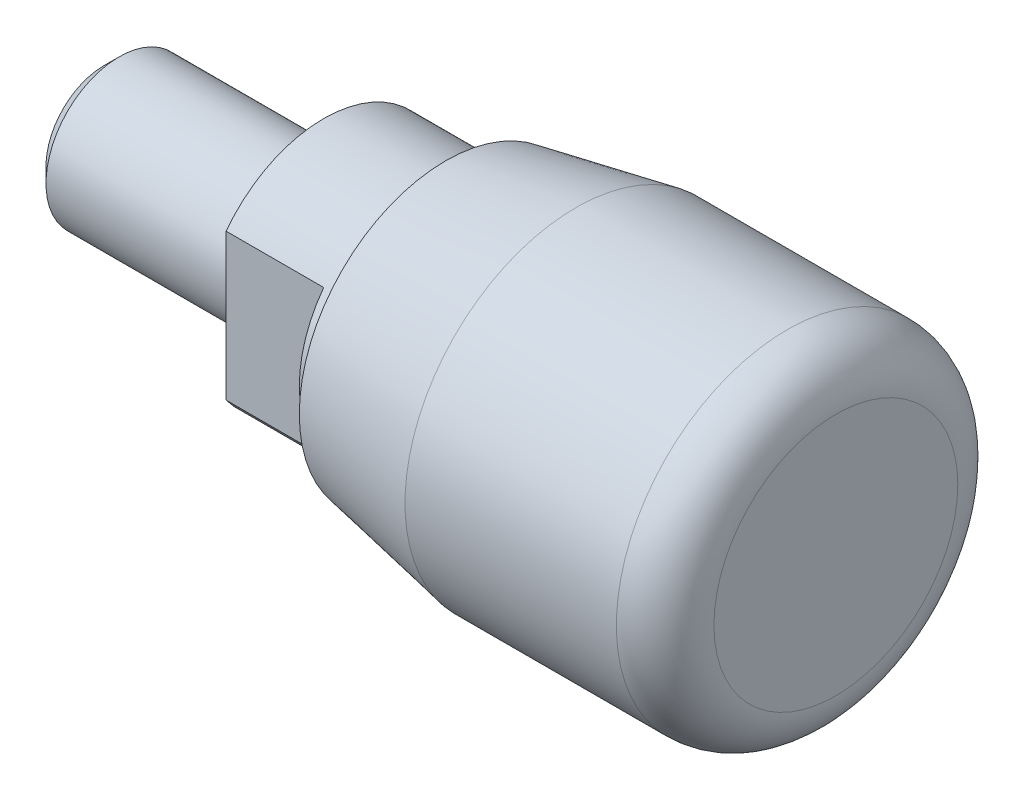
ISO-10303-21;
HEADER;
FILE_DESCRIPTION(('STEP AP214'),'2;1');
FILE_NAME('part.step','',(''),(''),'','','');
FILE_SCHEMA(('AUTOMOTIVE_DESIGN { 1 0 10303 214 1 1 1 1 }'));
ENDSEC;
DATA;
#1=APPLICATION_CONTEXT('core data for automotive mechanical design processes');
#2=APPLICATION_PROTOCOL_DEFINITION('international standard','automotive_design',2000,#1);
#3=PRODUCT_CONTEXT('',#1,'mechanical');
#4=PRODUCT('Part','Part','',(#3));
#5=PRODUCT_RELATED_PRODUCT_CATEGORY('part','',(#4));
#6=PRODUCT_DEFINITION_FORMATION('','',#4);
#7=PRODUCT_DEFINITION_CONTEXT('part definition',#1,'design');
#8=PRODUCT_DEFINITION('design','',#6,#7);
#9=PRODUCT_DEFINITION_SHAPE('','',#8);
#10=(LENGTH_UNIT() NAMED_UNIT(*) SI_UNIT(.MILLI.,.METRE.));
#11=(NAMED_UNIT(*) PLANE_ANGLE_UNIT() SI_UNIT($,.RADIAN.));
#12=(NAMED_UNIT(*) SI_UNIT($,.STERADIAN.) SOLID_ANGLE_UNIT());
#13=UNCERTAINTY_MEASURE_WITH_UNIT(LENGTH_MEASURE(1.E-05),#10,'distance_accuracy_value','');
#14=(GEOMETRIC_REPRESENTATION_CONTEXT(3) GLOBAL_UNCERTAINTY_ASSIGNED_CONTEXT((#13)) GLOBAL_UNIT_ASSIGNED_CONTEXT((#10,
#11,#12)) REPRESENTATION_CONTEXT('',''));
#15=CARTESIAN_POINT('',(0.,0.,0.));
#16=DIRECTION('',(0.,0.,1.));
#17=DIRECTION('',(1.,0.,0.));
#18=AXIS2_PLACEMENT_3D('',#15,#16,#17);
#19=CARTESIAN_POINT('',(4.,3.,4.));
#20=DIRECTION('',(0.,0.,-1.));
#21=DIRECTION('',(0.,-1.,0.));
#22=AXIS2_PLACEMENT_3D('',#19,#20,#21);
#23=PLANE('',#22);
#24=DIRECTION('',(0.,-1.,0.));
#25=VECTOR('',#24,1.);
#26=CARTESIAN_POINT('',(0.,3.,4.));
#27=LINE('',#26,#25);
#28=CARTESIAN_POINT('',(0.,3.,4.));
#29=VERTEX_POINT('',#28);
#30=CARTESIAN_POINT('',(0.,-3.,4.));
#31=VERTEX_POINT('',#30);
#32=EDGE_CURVE('E131',#29,#31,#27,.T.);
#33=ORIENTED_EDGE('',*,*,#32,.T.);
#34=DIRECTION('',(-1.,0.,0.));
#35=VECTOR('',#34,1.);
#36=CARTESIAN_POINT('',(4.,-3.,4.));
#37=LINE('',#36,#35);
#38=CARTESIAN_POINT('',(4.,-3.,4.));
#39=VERTEX_POINT('',#38);
#40=EDGE_CURVE('E119',#39,#31,#37,.T.);
#41=ORIENTED_EDGE('',*,*,#40,.F.);
#42=DIRECTION('',(0.,-1.,0.));
#43=VECTOR('',#42,1.);
#44=CARTESIAN_POINT('',(4.,3.,4.));
#45=LINE('',#44,#43);
#46=CARTESIAN_POINT('',(4.,3.,4.));
#47=VERTEX_POINT('',#46);
#48=EDGE_CURVE('E10',#47,#39,#45,.T.);
#49=ORIENTED_EDGE('',*,*,#48,.F.);
#50=DIRECTION('',(-1.,0.,0.));
#51=VECTOR('',#50,1.);
#52=CARTESIAN_POINT('',(4.,3.,4.));
#53=LINE('',#52,#51);
#54=EDGE_CURVE('E72',#47,#29,#53,.T.);
#55=ORIENTED_EDGE('',*,*,#54,.T.);
#56=EDGE_LOOP('',(#33,#41,#49,#55));
#57=FACE_BOUND('',#56,.T.);
#58=ADVANCED_FACE('F15',(#57),#23,.F.);
#59=CARTESIAN_POINT('',(4.,0.,0.));
#60=DIRECTION('',(1.,0.,0.));
#61=DIRECTION('',(0.,1.,0.));
#62=AXIS2_PLACEMENT_3D('',#59,#60,#61);
#63=PLANE('',#62);
#64=ORIENTED_EDGE('',*,*,#48,.T.);
#65=CARTESIAN_POINT('',(4.,0.,0.));
#66=DIRECTION('',(1.,0.,0.));
#67=DIRECTION('',(0.,0.,-1.));
#68=AXIS2_PLACEMENT_3D('',#65,#66,#67);
#69=CIRCLE('',#68,5.);
#70=EDGE_CURVE('E124',#47,#39,#69,.T.);
#71=ORIENTED_EDGE('',*,*,#70,.F.);
#72=EDGE_LOOP('',(#64,#71));
#73=FACE_BOUND('',#72,.T.);
#74=ADVANCED_FACE('F211',(#73),#63,.F.);
#75=CARTESIAN_POINT('',(4.,-3.,-4.));
#76=DIRECTION('',(0.,0.,1.));
#77=DIRECTION('',(1.,0.,0.));
#78=AXIS2_PLACEMENT_3D('',#75,#76,#77);
#79=PLANE('',#78);
#80=DIRECTION('',(0.,1.,0.));
#81=VECTOR('',#80,1.);
#82=CARTESIAN_POINT('',(0.,-3.,-4.));
#83=LINE('',#82,#81);
#84=CARTESIAN_POINT('',(0.,-3.,-4.));
#85=VERTEX_POINT('',#84);
#86=CARTESIAN_POINT('',(0.,3.,-4.));
#87=VERTEX_POINT('',#86);
#88=EDGE_CURVE('E146',#85,#87,#83,.T.);
#89=ORIENTED_EDGE('',*,*,#88,.T.);
#90=DIRECTION('',(-1.,0.,0.));
#91=VECTOR('',#90,1.);
#92=CARTESIAN_POINT('',(4.,3.,-4.));
#93=LINE('',#92,#91);
#94=CARTESIAN_POINT('',(4.,3.,-4.));
#95=VERTEX_POINT('',#94);
#96=EDGE_CURVE('E139',#95,#87,#93,.T.);
#97=ORIENTED_EDGE('',*,*,#96,.F.);
#98=DIRECTION('',(0.,1.,0.));
#99=VECTOR('',#98,1.);
#100=CARTESIAN_POINT('',(4.,-3.,-4.));
#101=LINE('',#100,#99);
#102=CARTESIAN_POINT('',(4.,-3.,-4.));
#103=VERTEX_POINT('',#102);
#104=EDGE_CURVE('E26',#103,#95,#101,.T.);
#105=ORIENTED_EDGE('',*,*,#104,.F.);
#106=DIRECTION('',(-1.,0.,0.));
#107=VECTOR('',#106,1.);
#108=CARTESIAN_POINT('',(4.,-3.,-4.));
#109=LINE('',#108,#107);
#110=EDGE_CURVE('E56',#103,#85,#109,.T.);
#111=ORIENTED_EDGE('',*,*,#110,.T.);
#112=EDGE_LOOP('',(#89,#97,#105,#111));
#113=FACE_BOUND('',#112,.T.);
#114=ADVANCED_FACE('F173',(#113),#79,.F.);
#115=CARTESIAN_POINT('',(4.,0.,0.));
#116=DIRECTION('',(1.,0.,0.));
#117=DIRECTION('',(0.,1.,0.));
#118=AXIS2_PLACEMENT_3D('',#115,#116,#117);
#119=PLANE('',#118);
#120=ORIENTED_EDGE('',*,*,#104,.T.);
#121=CARTESIAN_POINT('',(4.,0.,0.));
#122=DIRECTION('',(1.,0.,0.));
#123=DIRECTION('',(0.,0.,-1.));
#124=AXIS2_PLACEMENT_3D('',#121,#122,#123);
#125=CIRCLE('',#124,5.);
#126=EDGE_CURVE('E130',#103,#95,#125,.T.);
#127=ORIENTED_EDGE('',*,*,#126,.F.);
#128=EDGE_LOOP('',(#120,#127));
#129=FACE_BOUND('',#128,.T.);
#130=ADVANCED_FACE('F181',(#129),#119,.F.);
#131=CARTESIAN_POINT('',(21.,5.,0.));
#132=DIRECTION('',(-1.,0.,0.));
#133=DIRECTION('',(0.,0.,1.));
#134=AXIS2_PLACEMENT_3D('',#131,#132,#133);
#135=PLANE('',#134);
#136=CARTESIAN_POINT('',(21.,0.,0.));
#137=DIRECTION('',(1.,0.,0.));
#138=DIRECTION('',(0.,0.,-1.));
#139=AXIS2_PLACEMENT_3D('',#136,#137,#138);
#140=CIRCLE('',#139,5.);
#141=CARTESIAN_POINT('',(21.,0.,-5.));
#142=VERTEX_POINT('',#141);
#143=EDGE_CURVE('E38',#142,#142,#140,.T.);
#144=ORIENTED_EDGE('',*,*,#143,.T.);
#145=EDGE_LOOP('',(#144));
#146=FACE_BOUND('',#145,.T.);
#147=ADVANCED_FACE('F225',(#146),#135,.F.);
#148=CARTESIAN_POINT('',(19.,0.,0.));
#149=DIRECTION('',(1.,0.,0.));
#150=DIRECTION('',(0.,0.,-1.));
#151=AXIS2_PLACEMENT_3D('',#148,#149,#150);
#152=TOROIDAL_SURFACE('',#151,5.,2.);
#153=ORIENTED_EDGE('',*,*,#143,.F.);
#154=EDGE_LOOP('',(#153));
#155=FACE_BOUND('',#154,.T.);
#156=CARTESIAN_POINT('',(19.,0.,0.));
#157=DIRECTION('',(1.,0.,0.));
#158=DIRECTION('',(0.,0.,-1.));
#159=AXIS2_PLACEMENT_3D('',#156,#157,#158);
#160=CIRCLE('',#159,7.);
#161=CARTESIAN_POINT('',(19.,0.,-7.));
#162=VERTEX_POINT('',#161);
#163=EDGE_CURVE('E117',#162,#162,#160,.T.);
#164=ORIENTED_EDGE('',*,*,#163,.T.);
#165=EDGE_LOOP('',(#164));
#166=FACE_BOUND('',#165,.T.);
#167=ADVANCED_FACE('F227',(#155,#166),#152,.T.);
#168=CARTESIAN_POINT('',(21.,0.,0.));
#169=DIRECTION('',(1.,0.,0.));
#170=DIRECTION('',(0.,0.,-1.));
#171=AXIS2_PLACEMENT_3D('',#168,#169,#170);
#172=CYLINDRICAL_SURFACE('',#171,7.);
#173=CARTESIAN_POINT('',(10.3333333333333,0.,0.));
#174=DIRECTION('',(1.,0.,0.));
#175=DIRECTION('',(0.,0.,-1.));
#176=AXIS2_PLACEMENT_3D('',#173,#174,#175);
#177=CIRCLE('',#176,7.);
#178=CARTESIAN_POINT('',(10.3333333333333,0.,-7.));
#179=VERTEX_POINT('',#178);
#180=EDGE_CURVE('E110',#179,#179,#177,.T.);
#181=ORIENTED_EDGE('',*,*,#180,.T.);
#182=EDGE_LOOP('',(#181));
#183=FACE_BOUND('',#182,.T.);
#184=ORIENTED_EDGE('',*,*,#163,.F.);
#185=EDGE_LOOP('',(#184));
#186=FACE_BOUND('',#185,.T.);
#187=ADVANCED_FACE('F219',(#183,#186),#172,.T.);
#188=CARTESIAN_POINT('',(5.,0.,0.));
#189=DIRECTION('',(1.,0.,0.));
#190=DIRECTION('',(0.,0.,-1.));
#191=AXIS2_PLACEMENT_3D('',#188,#189,#190);
#192=CONICAL_SURFACE('',#191,6.,0.185347949995695);
#193=CARTESIAN_POINT('',(5.,0.,0.));
#194=DIRECTION('',(1.,0.,0.));
#195=DIRECTION('',(0.,0.,-1.));
#196=AXIS2_PLACEMENT_3D('',#193,#194,#195);
#197=CIRCLE('',#196,6.);
#198=CARTESIAN_POINT('',(5.,0.,-6.));
#199=VERTEX_POINT('',#198);
#200=EDGE_CURVE('E105',#199,#199,#197,.T.);
#201=ORIENTED_EDGE('',*,*,#200,.T.);
#202=EDGE_LOOP('',(#201));
#203=FACE_BOUND('',#202,.T.);
#204=ORIENTED_EDGE('',*,*,#180,.F.);
#205=EDGE_LOOP('',(#204));
#206=FACE_BOUND('',#205,.T.);
#207=ADVANCED_FACE('F106',(#203,#206),#192,.T.);
#208=CARTESIAN_POINT('',(5.,5.,0.));
#209=DIRECTION('',(1.,0.,0.));
#210=DIRECTION('',(0.,1.,0.));
#211=AXIS2_PLACEMENT_3D('',#208,#209,#210);
#212=PLANE('',#211);
#213=CARTESIAN_POINT('',(5.,0.,0.));
#214=DIRECTION('',(1.,0.,0.));
#215=DIRECTION('',(0.,0.,-1.));
#216=AXIS2_PLACEMENT_3D('',#213,#214,#215);
#217=CIRCLE('',#216,5.);
#218=CARTESIAN_POINT('',(5.,0.,-5.));
#219=VERTEX_POINT('',#218);
#220=EDGE_CURVE('E127',#219,#219,#217,.T.);
#221=ORIENTED_EDGE('',*,*,#220,.T.);
#222=EDGE_LOOP('',(#221));
#223=FACE_BOUND('',#222,.T.);
#224=ORIENTED_EDGE('',*,*,#200,.F.);
#225=EDGE_LOOP('',(#224));
#226=FACE_BOUND('',#225,.T.);
#227=ADVANCED_FACE('F17',(#223,#226),#212,.F.);
#228=CARTESIAN_POINT('',(21.,0.,0.));
#229=DIRECTION('',(1.,0.,0.));
#230=DIRECTION('',(0.,0.,-1.));
#231=AXIS2_PLACEMENT_3D('',#228,#229,#230);
#232=CYLINDRICAL_SURFACE('',#231,5.);
#233=ORIENTED_EDGE('',*,*,#126,.T.);
#234=ORIENTED_EDGE('',*,*,#96,.T.);
#235=CARTESIAN_POINT('',(0.,0.,0.));
#236=DIRECTION('',(1.,0.,0.));
#237=DIRECTION('',(0.,0.,-1.));
#238=AXIS2_PLACEMENT_3D('',#235,#236,#237);
#239=CIRCLE('',#238,5.);
#240=EDGE_CURVE('E159',#87,#29,#239,.T.);
#241=ORIENTED_EDGE('',*,*,#240,.T.);
#242=ORIENTED_EDGE('',*,*,#54,.F.);
#243=ORIENTED_EDGE('',*,*,#70,.T.);
#244=ORIENTED_EDGE('',*,*,#40,.T.);
#245=CARTESIAN_POINT('',(0.,0.,0.));
#246=DIRECTION('',(1.,0.,0.));
#247=DIRECTION('',(0.,0.,-1.));
#248=AXIS2_PLACEMENT_3D('',#245,#246,#247);
#249=CIRCLE('',#248,5.);
#250=EDGE_CURVE('E19',#31,#85,#249,.T.);
#251=ORIENTED_EDGE('',*,*,#250,.T.);
#252=ORIENTED_EDGE('',*,*,#110,.F.);
#253=EDGE_LOOP('',(#233,#234,#241,#242,#243,#244,#251,#252));
#254=FACE_BOUND('',#253,.T.);
#255=ORIENTED_EDGE('',*,*,#220,.F.);
#256=EDGE_LOOP('',(#255));
#257=FACE_BOUND('',#256,.T.);
#258=ADVANCED_FACE('F177',(#254,#257),#232,.T.);
#259=CARTESIAN_POINT('',(0.,3.,0.));
#260=DIRECTION('',(1.,0.,0.));
#261=DIRECTION('',(0.,1.,0.));
#262=AXIS2_PLACEMENT_3D('',#259,#260,#261);
#263=PLANE('',#262);
#264=CARTESIAN_POINT('',(0.,0.,0.));
#265=DIRECTION('',(1.,0.,0.));
#266=DIRECTION('',(0.,0.,-1.));
#267=AXIS2_PLACEMENT_3D('',#264,#265,#266);
#268=CIRCLE('',#267,3.);
#269=CARTESIAN_POINT('',(0.,0.,-3.));
#270=VERTEX_POINT('',#269);
#271=EDGE_CURVE('E155',#270,#270,#268,.T.);
#272=ORIENTED_EDGE('',*,*,#271,.T.);
#273=EDGE_LOOP('',(#272));
#274=FACE_BOUND('',#273,.T.);
#275=ORIENTED_EDGE('',*,*,#240,.F.);
#276=ORIENTED_EDGE('',*,*,#88,.F.);
#277=ORIENTED_EDGE('',*,*,#250,.F.);
#278=ORIENTED_EDGE('',*,*,#32,.F.);
#279=EDGE_LOOP('',(#275,#276,#277,#278));
#280=FACE_BOUND('',#279,.T.);
#281=ADVANCED_FACE('F175',(#274,#280),#263,.F.);
#282=CARTESIAN_POINT('',(21.,0.,0.));
#283=DIRECTION('',(1.,0.,0.));
#284=DIRECTION('',(0.,0.,-1.));
#285=AXIS2_PLACEMENT_3D('',#282,#283,#284);
#286=CYLINDRICAL_SURFACE('',#285,3.);
#287=CARTESIAN_POINT('',(-8.3865,0.,0.));
#288=DIRECTION('',(1.,0.,0.));
#289=DIRECTION('',(0.,0.,-1.));
#290=AXIS2_PLACEMENT_3D('',#287,#288,#289);
#291=CIRCLE('',#290,3.);
#292=CARTESIAN_POINT('',(-8.3865,0.,-3.));
#293=VERTEX_POINT('',#292);
#294=EDGE_CURVE('E149',#293,#293,#291,.T.);
#295=ORIENTED_EDGE('',*,*,#294,.T.);
#296=EDGE_LOOP('',(#295));
#297=FACE_BOUND('',#296,.T.);
#298=ORIENTED_EDGE('',*,*,#271,.F.);
#299=EDGE_LOOP('',(#298));
#300=FACE_BOUND('',#299,.T.);
#301=ADVANCED_FACE('F195',(#297,#300),#286,.T.);
#302=CARTESIAN_POINT('',(-9.,0.,0.));
#303=DIRECTION('',(1.,0.,0.));
#304=DIRECTION('',(0.,0.,-1.));
#305=AXIS2_PLACEMENT_3D('',#302,#303,#304);
#306=CONICAL_SURFACE('',#305,2.3865,0.785398163397449);
#307=CARTESIAN_POINT('',(-9.,0.,0.));
#308=DIRECTION('',(1.,0.,0.));
#309=DIRECTION('',(0.,0.,-1.));
#310=AXIS2_PLACEMENT_3D('',#307,#308,#309);
#311=CIRCLE('',#310,2.3865);
#312=CARTESIAN_POINT('',(-9.,0.,-2.3865));
#313=VERTEX_POINT('',#312);
#314=EDGE_CURVE('E165',#313,#313,#311,.T.);
#315=ORIENTED_EDGE('',*,*,#314,.T.);
#316=EDGE_LOOP('',(#315));
#317=FACE_BOUND('',#316,.T.);
#318=ORIENTED_EDGE('',*,*,#294,.F.);
#319=EDGE_LOOP('',(#318));
#320=FACE_BOUND('',#319,.T.);
#321=ADVANCED_FACE('F197',(#317,#320),#306,.T.);
#322=CARTESIAN_POINT('',(-9.,0.,0.));
#323=DIRECTION('',(1.,0.,0.));
#324=DIRECTION('',(0.,1.,0.));
#325=AXIS2_PLACEMENT_3D('',#322,#323,#324);
#326=PLANE('',#325);
#327=ORIENTED_EDGE('',*,*,#314,.F.);
#328=EDGE_LOOP('',(#327));
#329=FACE_BOUND('',#328,.T.);
#330=ADVANCED_FACE('F204',(#329),#326,.F.);
#331=CLOSED_SHELL('',(#58,#74,#114,#130,#147,#167,#187,#207,#227,#258,#281,#301,#321,#330));
#332=MANIFOLD_SOLID_BREP('B1',#331);
#333=ADVANCED_BREP_SHAPE_REPRESENTATION('',(#18,#332),#14);
#334=SHAPE_DEFINITION_REPRESENTATION(#9,#333);
ENDSEC;
END-ISO-10303-21;
